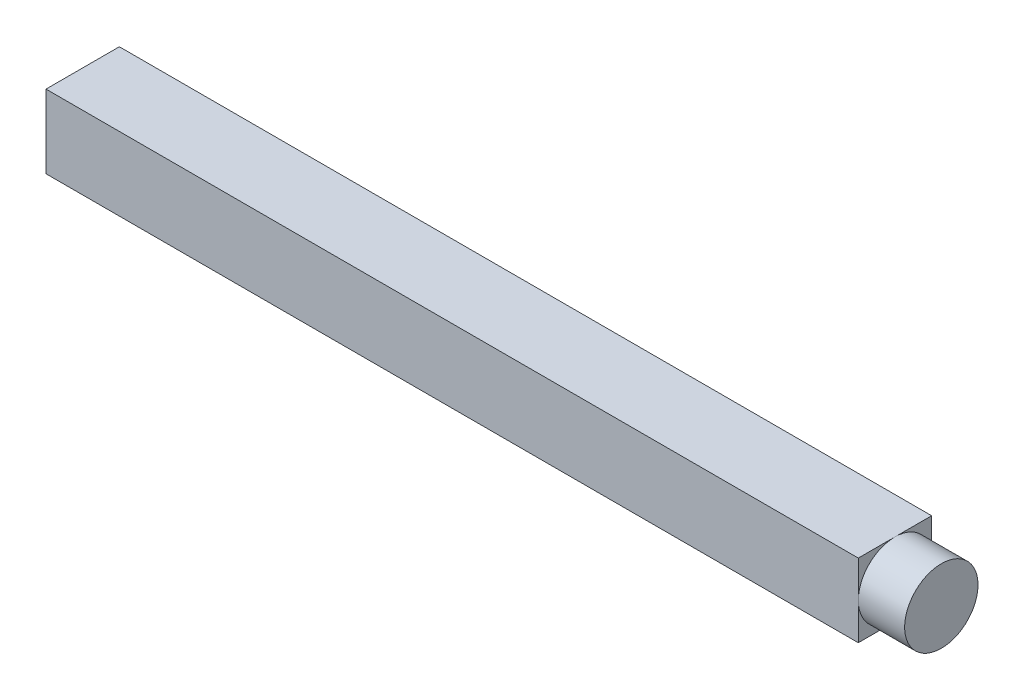
ISO-10303-21;
HEADER;
FILE_DESCRIPTION(('STEP AP214'),'2;1');
FILE_NAME('part.step','',(''),(''),'','','');
FILE_SCHEMA(('AUTOMOTIVE_DESIGN { 1 0 10303 214 1 1 1 1 }'));
ENDSEC;
DATA;
#1=APPLICATION_CONTEXT('core data for automotive mechanical design processes');
#2=APPLICATION_PROTOCOL_DEFINITION('international standard','automotive_design',2000,#1);
#3=PRODUCT_CONTEXT('',#1,'mechanical');
#4=PRODUCT('Part','Part','',(#3));
#5=PRODUCT_RELATED_PRODUCT_CATEGORY('part','',(#4));
#6=PRODUCT_DEFINITION_FORMATION('','',#4);
#7=PRODUCT_DEFINITION_CONTEXT('part definition',#1,'design');
#8=PRODUCT_DEFINITION('design','',#6,#7);
#9=PRODUCT_DEFINITION_SHAPE('','',#8);
#10=(LENGTH_UNIT() NAMED_UNIT(*) SI_UNIT(.MILLI.,.METRE.));
#11=(NAMED_UNIT(*) PLANE_ANGLE_UNIT() SI_UNIT($,.RADIAN.));
#12=(NAMED_UNIT(*) SI_UNIT($,.STERADIAN.) SOLID_ANGLE_UNIT());
#13=UNCERTAINTY_MEASURE_WITH_UNIT(LENGTH_MEASURE(1.E-05),#10,'distance_accuracy_value','');
#14=(GEOMETRIC_REPRESENTATION_CONTEXT(3) GLOBAL_UNCERTAINTY_ASSIGNED_CONTEXT((#13)) GLOBAL_UNIT_ASSIGNED_CONTEXT((#10,
#11,#12)) REPRESENTATION_CONTEXT('',''));
#15=CARTESIAN_POINT('',(0.,0.,0.));
#16=DIRECTION('',(0.,0.,1.));
#17=DIRECTION('',(1.,0.,0.));
#18=AXIS2_PLACEMENT_3D('',#15,#16,#17);
#19=CARTESIAN_POINT('',(83.317756121068,-3.175,-3.175));
#20=DIRECTION('',(0.,0.,1.));
#21=DIRECTION('',(1.,0.,0.));
#22=AXIS2_PLACEMENT_3D('',#19,#20,#21);
#23=PLANE('',#22);
#24=DIRECTION('',(0.,1.,0.));
#25=VECTOR('',#24,1.);
#26=CARTESIAN_POINT('',(70.3242999999989,-3.175,-3.175));
#27=LINE('',#26,#25);
#28=CARTESIAN_POINT('',(70.3242999999989,-3.175,-3.175));
#29=VERTEX_POINT('',#28);
#30=CARTESIAN_POINT('',(70.3242999999989,0.,-3.175));
#31=VERTEX_POINT('',#30);
#32=EDGE_CURVE('E106',#29,#31,#27,.T.);
#33=ORIENTED_EDGE('',*,*,#32,.F.);
#34=DIRECTION('',(-1.,0.,0.));
#35=VECTOR('',#34,1.);
#36=CARTESIAN_POINT('',(83.317756121068,-3.175,-3.175));
#37=LINE('',#36,#35);
#38=CARTESIAN_POINT('',(0.,-3.175,-3.175));
#39=VERTEX_POINT('',#38);
#40=EDGE_CURVE('E84',#29,#39,#37,.T.);
#41=ORIENTED_EDGE('',*,*,#40,.T.);
#42=DIRECTION('',(0.,1.,0.));
#43=VECTOR('',#42,1.);
#44=CARTESIAN_POINT('',(0.,-3.175,-3.175));
#45=LINE('',#44,#43);
#46=CARTESIAN_POINT('',(0.,3.175,-3.175));
#47=VERTEX_POINT('',#46);
#48=EDGE_CURVE('E135',#39,#47,#45,.T.);
#49=ORIENTED_EDGE('',*,*,#48,.T.);
#50=DIRECTION('',(-1.,0.,0.));
#51=VECTOR('',#50,1.);
#52=CARTESIAN_POINT('',(83.317756121068,3.175,-3.175));
#53=LINE('',#52,#51);
#54=CARTESIAN_POINT('',(70.3242999999989,3.175,-3.175));
#55=VERTEX_POINT('',#54);
#56=EDGE_CURVE('E76',#55,#47,#53,.T.);
#57=ORIENTED_EDGE('',*,*,#56,.F.);
#58=EDGE_CURVE('E91',#31,#55,#27,.T.);
#59=ORIENTED_EDGE('',*,*,#58,.F.);
#60=EDGE_LOOP('',(#33,#41,#49,#57,#59));
#61=FACE_BOUND('',#60,.T.);
#62=ADVANCED_FACE('F39',(#61),#23,.F.);
#63=CARTESIAN_POINT('',(83.317756121068,3.175,3.175));
#64=DIRECTION('',(0.,-1.,0.));
#65=DIRECTION('',(0.,0.,-1.));
#66=AXIS2_PLACEMENT_3D('',#63,#64,#65);
#67=PLANE('',#66);
#68=DIRECTION('',(0.,0.,1.));
#69=VECTOR('',#68,1.);
#70=CARTESIAN_POINT('',(70.3242999999989,3.175,3.175));
#71=LINE('',#70,#69);
#72=CARTESIAN_POINT('',(70.3242999999989,3.175,-6.66133814775094E-13));
#73=VERTEX_POINT('',#72);
#74=EDGE_CURVE('E113',#55,#73,#71,.T.);
#75=ORIENTED_EDGE('',*,*,#74,.F.);
#76=ORIENTED_EDGE('',*,*,#56,.T.);
#77=DIRECTION('',(0.,0.,1.));
#78=VECTOR('',#77,1.);
#79=CARTESIAN_POINT('',(0.,3.175,3.175));
#80=LINE('',#79,#78);
#81=CARTESIAN_POINT('',(0.,3.175,3.175));
#82=VERTEX_POINT('',#81);
#83=EDGE_CURVE('E133',#47,#82,#80,.T.);
#84=ORIENTED_EDGE('',*,*,#83,.T.);
#85=DIRECTION('',(-1.,0.,0.));
#86=VECTOR('',#85,1.);
#87=CARTESIAN_POINT('',(83.317756121068,3.175,3.175));
#88=LINE('',#87,#86);
#89=CARTESIAN_POINT('',(70.3242999999989,3.175,3.175));
#90=VERTEX_POINT('',#89);
#91=EDGE_CURVE('E132',#90,#82,#88,.T.);
#92=ORIENTED_EDGE('',*,*,#91,.F.);
#93=EDGE_CURVE('E123',#73,#90,#71,.T.);
#94=ORIENTED_EDGE('',*,*,#93,.F.);
#95=EDGE_LOOP('',(#75,#76,#84,#92,#94));
#96=FACE_BOUND('',#95,.T.);
#97=ADVANCED_FACE('F156',(#96),#67,.F.);
#98=CARTESIAN_POINT('',(83.317756121068,-3.175,3.175));
#99=DIRECTION('',(0.,0.,-1.));
#100=DIRECTION('',(-1.,0.,0.));
#101=AXIS2_PLACEMENT_3D('',#98,#99,#100);
#102=PLANE('',#101);
#103=DIRECTION('',(0.,-1.,0.));
#104=VECTOR('',#103,1.);
#105=CARTESIAN_POINT('',(70.3242999999989,-3.175,3.175));
#106=LINE('',#105,#104);
#107=CARTESIAN_POINT('',(70.3242999999989,0.,3.175));
#108=VERTEX_POINT('',#107);
#109=EDGE_CURVE('E181',#90,#108,#106,.T.);
#110=ORIENTED_EDGE('',*,*,#109,.F.);
#111=ORIENTED_EDGE('',*,*,#91,.T.);
#112=DIRECTION('',(0.,-1.,0.));
#113=VECTOR('',#112,1.);
#114=CARTESIAN_POINT('',(0.,-3.175,3.175));
#115=LINE('',#114,#113);
#116=CARTESIAN_POINT('',(0.,-3.175,3.175));
#117=VERTEX_POINT('',#116);
#118=EDGE_CURVE('E130',#82,#117,#115,.T.);
#119=ORIENTED_EDGE('',*,*,#118,.T.);
#120=DIRECTION('',(-1.,0.,0.));
#121=VECTOR('',#120,1.);
#122=CARTESIAN_POINT('',(83.317756121068,-3.175,3.175));
#123=LINE('',#122,#121);
#124=CARTESIAN_POINT('',(70.3242999999989,-3.175,3.175));
#125=VERTEX_POINT('',#124);
#126=EDGE_CURVE('E63',#125,#117,#123,.T.);
#127=ORIENTED_EDGE('',*,*,#126,.F.);
#128=EDGE_CURVE('E122',#108,#125,#106,.T.);
#129=ORIENTED_EDGE('',*,*,#128,.F.);
#130=EDGE_LOOP('',(#110,#111,#119,#127,#129));
#131=FACE_BOUND('',#130,.T.);
#132=ADVANCED_FACE('F161',(#131),#102,.F.);
#133=CARTESIAN_POINT('',(83.317756121068,-3.175,3.175));
#134=DIRECTION('',(0.,1.,0.));
#135=DIRECTION('',(0.,0.,1.));
#136=AXIS2_PLACEMENT_3D('',#133,#134,#135);
#137=PLANE('',#136);
#138=DIRECTION('',(0.,0.,-1.));
#139=VECTOR('',#138,1.);
#140=CARTESIAN_POINT('',(70.3242999999989,-3.175,3.175));
#141=LINE('',#140,#139);
#142=CARTESIAN_POINT('',(70.3242999999989,-3.175,-6.66133814775094E-13));
#143=VERTEX_POINT('',#142);
#144=EDGE_CURVE('E11',#125,#143,#141,.T.);
#145=ORIENTED_EDGE('',*,*,#144,.F.);
#146=ORIENTED_EDGE('',*,*,#126,.T.);
#147=DIRECTION('',(0.,0.,-1.));
#148=VECTOR('',#147,1.);
#149=CARTESIAN_POINT('',(0.,-3.175,3.175));
#150=LINE('',#149,#148);
#151=EDGE_CURVE('E127',#117,#39,#150,.T.);
#152=ORIENTED_EDGE('',*,*,#151,.T.);
#153=ORIENTED_EDGE('',*,*,#40,.F.);
#154=EDGE_CURVE('E43',#143,#29,#141,.T.);
#155=ORIENTED_EDGE('',*,*,#154,.F.);
#156=EDGE_LOOP('',(#145,#146,#152,#153,#155));
#157=FACE_BOUND('',#156,.T.);
#158=ADVANCED_FACE('F166',(#157),#137,.F.);
#159=CARTESIAN_POINT('',(0.,0.,0.));
#160=DIRECTION('',(-1.,0.,0.));
#161=DIRECTION('',(0.,0.,1.));
#162=AXIS2_PLACEMENT_3D('',#159,#160,#161);
#163=PLANE('',#162);
#164=ORIENTED_EDGE('',*,*,#48,.F.);
#165=ORIENTED_EDGE('',*,*,#151,.F.);
#166=ORIENTED_EDGE('',*,*,#118,.F.);
#167=ORIENTED_EDGE('',*,*,#83,.F.);
#168=EDGE_LOOP('',(#164,#165,#166,#167));
#169=FACE_BOUND('',#168,.T.);
#170=ADVANCED_FACE('F169',(#169),#163,.T.);
#171=CARTESIAN_POINT('',(70.3242999999989,0.,-6.93889390390723E-13));
#172=DIRECTION('',(1.,0.,0.));
#173=DIRECTION('',(0.,-0.942708821052497,-0.333616664316716));
#174=AXIS2_PLACEMENT_3D('',#171,#172,#173);
#175=PLANE('',#174);
#176=ORIENTED_EDGE('',*,*,#32,.T.);
#177=CARTESIAN_POINT('',(70.3242999999989,0.,-6.66133814775094E-13));
#178=DIRECTION('',(1.,0.,0.));
#179=DIRECTION('',(0.,0.,-1.));
#180=AXIS2_PLACEMENT_3D('',#177,#178,#179);
#181=CIRCLE('',#180,3.175);
#182=EDGE_CURVE('E54',#31,#143,#181,.F.);
#183=ORIENTED_EDGE('',*,*,#182,.T.);
#184=ORIENTED_EDGE('',*,*,#154,.T.);
#185=EDGE_LOOP('',(#176,#183,#184));
#186=FACE_BOUND('',#185,.T.);
#187=ADVANCED_FACE('F107',(#186),#175,.T.);
#188=ORIENTED_EDGE('',*,*,#58,.T.);
#189=ORIENTED_EDGE('',*,*,#74,.T.);
#190=EDGE_CURVE('E111',#73,#31,#181,.F.);
#191=ORIENTED_EDGE('',*,*,#190,.T.);
#192=EDGE_LOOP('',(#188,#189,#191));
#193=FACE_BOUND('',#192,.T.);
#194=ADVANCED_FACE('F112',(#193),#175,.T.);
#195=ORIENTED_EDGE('',*,*,#93,.T.);
#196=ORIENTED_EDGE('',*,*,#109,.T.);
#197=EDGE_CURVE('E117',#108,#73,#181,.F.);
#198=ORIENTED_EDGE('',*,*,#197,.T.);
#199=EDGE_LOOP('',(#195,#196,#198));
#200=FACE_BOUND('',#199,.T.);
#201=ADVANCED_FACE('F151',(#200),#175,.T.);
#202=ORIENTED_EDGE('',*,*,#128,.T.);
#203=ORIENTED_EDGE('',*,*,#144,.T.);
#204=EDGE_CURVE('E121',#143,#108,#181,.F.);
#205=ORIENTED_EDGE('',*,*,#204,.T.);
#206=EDGE_LOOP('',(#202,#203,#205));
#207=FACE_BOUND('',#206,.T.);
#208=ADVANCED_FACE('F145',(#207),#175,.T.);
#209=CARTESIAN_POINT('',(60.984833634087,0.,-6.66133814775094E-13));
#210=DIRECTION('',(1.,0.,0.));
#211=DIRECTION('',(0.,0.,-1.));
#212=AXIS2_PLACEMENT_3D('',#209,#210,#211);
#213=CYLINDRICAL_SURFACE('',#212,3.175);
#214=CARTESIAN_POINT('',(74.3374999999989,0.,-6.66133814775094E-13));
#215=DIRECTION('',(1.,0.,0.));
#216=DIRECTION('',(0.,0.,-1.));
#217=AXIS2_PLACEMENT_3D('',#214,#215,#216);
#218=CIRCLE('',#217,3.175);
#219=CARTESIAN_POINT('',(74.3374999999989,0.,-3.17500000000067));
#220=VERTEX_POINT('',#219);
#221=EDGE_CURVE('E129',#220,#220,#218,.T.);
#222=ORIENTED_EDGE('',*,*,#221,.F.);
#223=EDGE_LOOP('',(#222));
#224=FACE_BOUND('',#223,.T.);
#225=ORIENTED_EDGE('',*,*,#182,.F.);
#226=ORIENTED_EDGE('',*,*,#190,.F.);
#227=ORIENTED_EDGE('',*,*,#197,.F.);
#228=ORIENTED_EDGE('',*,*,#204,.F.);
#229=EDGE_LOOP('',(#225,#226,#227,#228));
#230=FACE_BOUND('',#229,.T.);
#231=ADVANCED_FACE('F119',(#224,#230),#213,.T.);
#232=CARTESIAN_POINT('',(74.3374999999989,-35.7846857440135,-147.456559871451));
#233=DIRECTION('',(1.,0.,0.));
#234=DIRECTION('',(0.,-0.0280351143505346,-0.999606938933175));
#235=AXIS2_PLACEMENT_3D('',#232,#233,#234);
#236=PLANE('',#235);
#237=ORIENTED_EDGE('',*,*,#221,.T.);
#238=EDGE_LOOP('',(#237));
#239=FACE_BOUND('',#238,.T.);
#240=ADVANCED_FACE('F41',(#239),#236,.T.);
#241=CLOSED_SHELL('',(#62,#97,#132,#158,#170,#187,#194,#201,#208,#231,#240));
#242=MANIFOLD_SOLID_BREP('B2',#241);
#243=ADVANCED_BREP_SHAPE_REPRESENTATION('',(#18,#242),#14);
#244=SHAPE_DEFINITION_REPRESENTATION(#9,#243);
ENDSEC;
END-ISO-10303-21;
